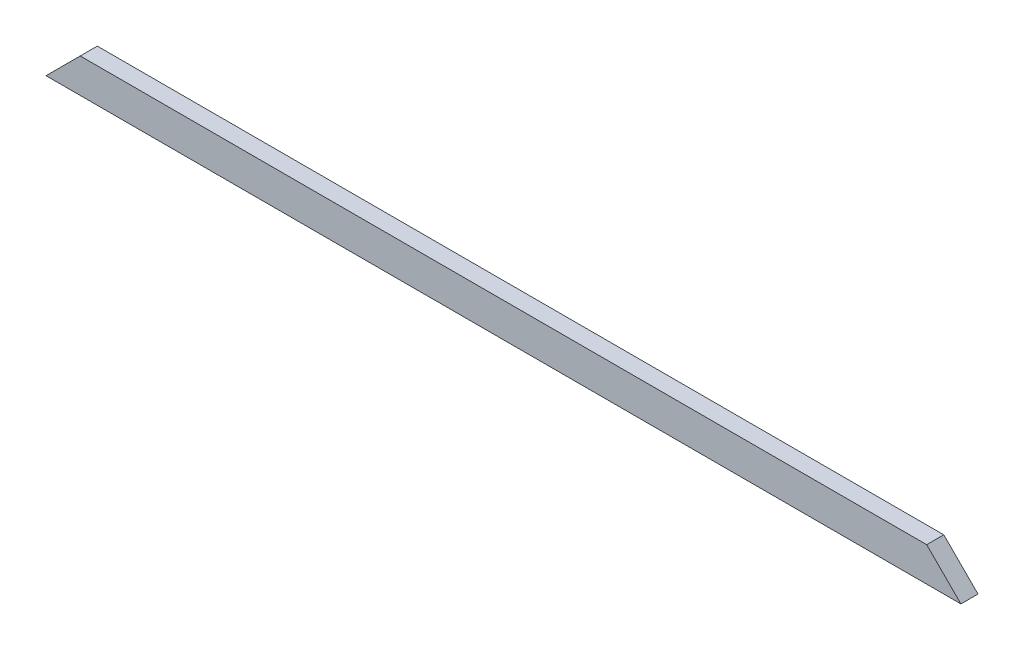
ISO-10303-21;
HEADER;
FILE_DESCRIPTION(('STEP AP214'),'2;1');
FILE_NAME('part.step','',(''),(''),'','','');
FILE_SCHEMA(('AUTOMOTIVE_DESIGN { 1 0 10303 214 1 1 1 1 }'));
ENDSEC;
DATA;
#1=APPLICATION_CONTEXT('core data for automotive mechanical design processes');
#2=APPLICATION_PROTOCOL_DEFINITION('international standard','automotive_design',2000,#1);
#3=PRODUCT_CONTEXT('',#1,'mechanical');
#4=PRODUCT('Part','Part','',(#3));
#5=PRODUCT_RELATED_PRODUCT_CATEGORY('part','',(#4));
#6=PRODUCT_DEFINITION_FORMATION('','',#4);
#7=PRODUCT_DEFINITION_CONTEXT('part definition',#1,'design');
#8=PRODUCT_DEFINITION('design','',#6,#7);
#9=PRODUCT_DEFINITION_SHAPE('','',#8);
#10=(LENGTH_UNIT() NAMED_UNIT(*) SI_UNIT(.MILLI.,.METRE.));
#11=(NAMED_UNIT(*) PLANE_ANGLE_UNIT() SI_UNIT($,.RADIAN.));
#12=(NAMED_UNIT(*) SI_UNIT($,.STERADIAN.) SOLID_ANGLE_UNIT());
#13=UNCERTAINTY_MEASURE_WITH_UNIT(LENGTH_MEASURE(1.E-05),#10,'distance_accuracy_value','');
#14=(GEOMETRIC_REPRESENTATION_CONTEXT(3) GLOBAL_UNCERTAINTY_ASSIGNED_CONTEXT((#13)) GLOBAL_UNIT_ASSIGNED_CONTEXT((#10,
#11,#12)) REPRESENTATION_CONTEXT('',''));
#15=CARTESIAN_POINT('',(0.,0.,0.));
#16=DIRECTION('',(0.,0.,1.));
#17=DIRECTION('',(1.,0.,0.));
#18=AXIS2_PLACEMENT_3D('',#15,#16,#17);
#19=CARTESIAN_POINT('',(0.,0.,19.05));
#20=DIRECTION('',(0.,1.,0.));
#21=DIRECTION('',(0.,0.,1.));
#22=AXIS2_PLACEMENT_3D('',#19,#20,#21);
#23=PLANE('',#22);
#24=DIRECTION('',(1.,0.,0.));
#25=VECTOR('',#24,1.);
#26=CARTESIAN_POINT('',(0.,0.,0.));
#27=LINE('',#26,#25);
#28=CARTESIAN_POINT('',(0.,0.,0.));
#29=VERTEX_POINT('',#28);
#30=CARTESIAN_POINT('',(1019.175,0.,0.));
#31=VERTEX_POINT('',#30);
#32=EDGE_CURVE('E96',#29,#31,#27,.T.);
#33=ORIENTED_EDGE('',*,*,#32,.T.);
#34=DIRECTION('',(0.,0.,-1.));
#35=VECTOR('',#34,1.);
#36=CARTESIAN_POINT('',(1019.175,0.,19.05));
#37=LINE('',#36,#35);
#38=CARTESIAN_POINT('',(1019.175,0.,19.05));
#39=VERTEX_POINT('',#38);
#40=EDGE_CURVE('E11',#39,#31,#37,.T.);
#41=ORIENTED_EDGE('',*,*,#40,.F.);
#42=DIRECTION('',(1.,0.,0.));
#43=VECTOR('',#42,1.);
#44=CARTESIAN_POINT('',(0.,0.,19.05));
#45=LINE('',#44,#43);
#46=CARTESIAN_POINT('',(0.,0.,19.05));
#47=VERTEX_POINT('',#46);
#48=EDGE_CURVE('E84',#47,#39,#45,.T.);
#49=ORIENTED_EDGE('',*,*,#48,.F.);
#50=DIRECTION('',(0.,0.,-1.));
#51=VECTOR('',#50,1.);
#52=CARTESIAN_POINT('',(0.,0.,19.05));
#53=LINE('',#52,#51);
#54=EDGE_CURVE('E92',#47,#29,#53,.T.);
#55=ORIENTED_EDGE('',*,*,#54,.T.);
#56=EDGE_LOOP('',(#33,#41,#49,#55));
#57=FACE_BOUND('',#56,.T.);
#58=ADVANCED_FACE('F33',(#57),#23,.F.);
#59=CARTESIAN_POINT('',(1019.175,0.,19.05));
#60=DIRECTION('',(-0.707106781186545,-0.70710678118655,0.));
#61=DIRECTION('',(0.70710678118655,-0.707106781186545,0.));
#62=AXIS2_PLACEMENT_3D('',#59,#60,#61);
#63=PLANE('',#62);
#64=DIRECTION('',(-0.70710678118655,0.707106781186545,0.));
#65=VECTOR('',#64,1.);
#66=CARTESIAN_POINT('',(1019.175,0.,0.));
#67=LINE('',#66,#65);
#68=CARTESIAN_POINT('',(981.075,38.1,0.));
#69=VERTEX_POINT('',#68);
#70=EDGE_CURVE('E88',#31,#69,#67,.T.);
#71=ORIENTED_EDGE('',*,*,#70,.T.);
#72=DIRECTION('',(0.,0.,-1.));
#73=VECTOR('',#72,1.);
#74=CARTESIAN_POINT('',(981.075,38.1,19.05));
#75=LINE('',#74,#73);
#76=CARTESIAN_POINT('',(981.075,38.1,19.05));
#77=VERTEX_POINT('',#76);
#78=EDGE_CURVE('E41',#77,#69,#75,.T.);
#79=ORIENTED_EDGE('',*,*,#78,.F.);
#80=DIRECTION('',(-0.70710678118655,0.707106781186545,0.));
#81=VECTOR('',#80,1.);
#82=CARTESIAN_POINT('',(1019.175,0.,19.05));
#83=LINE('',#82,#81);
#84=EDGE_CURVE('E79',#39,#77,#83,.T.);
#85=ORIENTED_EDGE('',*,*,#84,.F.);
#86=ORIENTED_EDGE('',*,*,#40,.T.);
#87=EDGE_LOOP('',(#71,#79,#85,#86));
#88=FACE_BOUND('',#87,.T.);
#89=ADVANCED_FACE('F87',(#88),#63,.F.);
#90=CARTESIAN_POINT('',(38.0999999999998,38.1,19.05));
#91=DIRECTION('',(0.,-1.,0.));
#92=DIRECTION('',(0.,0.,-1.));
#93=AXIS2_PLACEMENT_3D('',#90,#91,#92);
#94=PLANE('',#93);
#95=DIRECTION('',(-1.,0.,0.));
#96=VECTOR('',#95,1.);
#97=CARTESIAN_POINT('',(38.0999999999998,38.1,0.));
#98=LINE('',#97,#96);
#99=CARTESIAN_POINT('',(38.0999999999998,38.1,0.));
#100=VERTEX_POINT('',#99);
#101=EDGE_CURVE('E66',#69,#100,#98,.T.);
#102=ORIENTED_EDGE('',*,*,#101,.T.);
#103=DIRECTION('',(0.,0.,-1.));
#104=VECTOR('',#103,1.);
#105=CARTESIAN_POINT('',(38.0999999999998,38.1,19.05));
#106=LINE('',#105,#104);
#107=CARTESIAN_POINT('',(38.0999999999998,38.1,19.05));
#108=VERTEX_POINT('',#107);
#109=EDGE_CURVE('E89',#108,#100,#106,.T.);
#110=ORIENTED_EDGE('',*,*,#109,.F.);
#111=DIRECTION('',(-1.,0.,0.));
#112=VECTOR('',#111,1.);
#113=CARTESIAN_POINT('',(38.0999999999998,38.1,19.05));
#114=LINE('',#113,#112);
#115=EDGE_CURVE('E82',#77,#108,#114,.T.);
#116=ORIENTED_EDGE('',*,*,#115,.F.);
#117=ORIENTED_EDGE('',*,*,#78,.T.);
#118=EDGE_LOOP('',(#102,#110,#116,#117));
#119=FACE_BOUND('',#118,.T.);
#120=ADVANCED_FACE('F90',(#119),#94,.F.);
#121=CARTESIAN_POINT('',(0.,0.,19.05));
#122=DIRECTION('',(0.707106781186549,-0.707106781186546,0.));
#123=DIRECTION('',(0.707106781186546,0.707106781186549,0.));
#124=AXIS2_PLACEMENT_3D('',#121,#122,#123);
#125=PLANE('',#124);
#126=DIRECTION('',(-0.707106781186546,-0.707106781186549,0.));
#127=VECTOR('',#126,1.);
#128=CARTESIAN_POINT('',(0.,0.,0.));
#129=LINE('',#128,#127);
#130=EDGE_CURVE('E72',#100,#29,#129,.T.);
#131=ORIENTED_EDGE('',*,*,#130,.T.);
#132=ORIENTED_EDGE('',*,*,#54,.F.);
#133=DIRECTION('',(-0.707106781186546,-0.707106781186549,0.));
#134=VECTOR('',#133,1.);
#135=CARTESIAN_POINT('',(0.,0.,19.05));
#136=LINE('',#135,#134);
#137=EDGE_CURVE('E49',#108,#47,#136,.T.);
#138=ORIENTED_EDGE('',*,*,#137,.F.);
#139=ORIENTED_EDGE('',*,*,#109,.T.);
#140=EDGE_LOOP('',(#131,#132,#138,#139));
#141=FACE_BOUND('',#140,.T.);
#142=ADVANCED_FACE('F103',(#141),#125,.F.);
#143=CARTESIAN_POINT('',(0.,0.,19.05));
#144=DIRECTION('',(0.,0.,1.));
#145=DIRECTION('',(1.,0.,0.));
#146=AXIS2_PLACEMENT_3D('',#143,#144,#145);
#147=PLANE('',#146);
#148=ORIENTED_EDGE('',*,*,#48,.T.);
#149=ORIENTED_EDGE('',*,*,#84,.T.);
#150=ORIENTED_EDGE('',*,*,#115,.T.);
#151=ORIENTED_EDGE('',*,*,#137,.T.);
#152=EDGE_LOOP('',(#148,#149,#150,#151));
#153=FACE_BOUND('',#152,.T.);
#154=ADVANCED_FACE('F80',(#153),#147,.T.);
#155=CARTESIAN_POINT('',(0.,0.,0.));
#156=DIRECTION('',(0.,0.,1.));
#157=DIRECTION('',(1.,0.,0.));
#158=AXIS2_PLACEMENT_3D('',#155,#156,#157);
#159=PLANE('',#158);
#160=ORIENTED_EDGE('',*,*,#32,.F.);
#161=ORIENTED_EDGE('',*,*,#130,.F.);
#162=ORIENTED_EDGE('',*,*,#101,.F.);
#163=ORIENTED_EDGE('',*,*,#70,.F.);
#164=EDGE_LOOP('',(#160,#161,#162,#163));
#165=FACE_BOUND('',#164,.T.);
#166=ADVANCED_FACE('F106',(#165),#159,.F.);
#167=CLOSED_SHELL('',(#58,#89,#120,#142,#154,#166));
#168=MANIFOLD_SOLID_BREP('B2',#167);
#169=ADVANCED_BREP_SHAPE_REPRESENTATION('',(#18,#168),#14);
#170=SHAPE_DEFINITION_REPRESENTATION(#9,#169);
ENDSEC;
END-ISO-10303-21;
